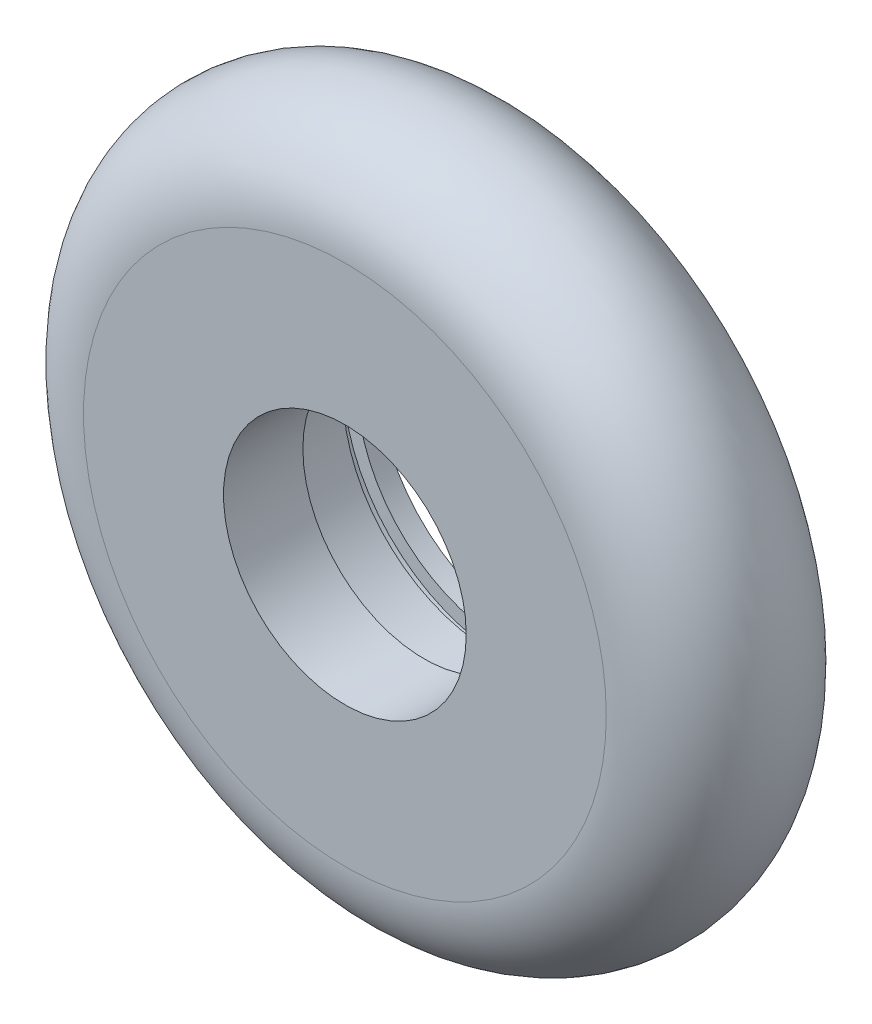
ISO-10303-21;
HEADER;
FILE_DESCRIPTION(('STEP AP214'),'2;1');
FILE_NAME('part.step','',(''),(''),'','','');
FILE_SCHEMA(('AUTOMOTIVE_DESIGN { 1 0 10303 214 1 1 1 1 }'));
ENDSEC;
DATA;
#1=APPLICATION_CONTEXT('core data for automotive mechanical design processes');
#2=APPLICATION_PROTOCOL_DEFINITION('international standard','automotive_design',2000,#1);
#3=PRODUCT_CONTEXT('',#1,'mechanical');
#4=PRODUCT('Part','Part','',(#3));
#5=PRODUCT_RELATED_PRODUCT_CATEGORY('part','',(#4));
#6=PRODUCT_DEFINITION_FORMATION('','',#4);
#7=PRODUCT_DEFINITION_CONTEXT('part definition',#1,'design');
#8=PRODUCT_DEFINITION('design','',#6,#7);
#9=PRODUCT_DEFINITION_SHAPE('','',#8);
#10=(LENGTH_UNIT() NAMED_UNIT(*) SI_UNIT(.MILLI.,.METRE.));
#11=(NAMED_UNIT(*) PLANE_ANGLE_UNIT() SI_UNIT($,.RADIAN.));
#12=(NAMED_UNIT(*) SI_UNIT($,.STERADIAN.) SOLID_ANGLE_UNIT());
#13=UNCERTAINTY_MEASURE_WITH_UNIT(LENGTH_MEASURE(1.E-05),#10,'distance_accuracy_value','');
#14=(GEOMETRIC_REPRESENTATION_CONTEXT(3) GLOBAL_UNCERTAINTY_ASSIGNED_CONTEXT((#13)) GLOBAL_UNIT_ASSIGNED_CONTEXT((#10,
#11,#12)) REPRESENTATION_CONTEXT('',''));
#15=CARTESIAN_POINT('',(0.,0.,0.));
#16=DIRECTION('',(0.,0.,1.));
#17=DIRECTION('',(1.,0.,0.));
#18=AXIS2_PLACEMENT_3D('',#15,#16,#17);
#19=CARTESIAN_POINT('',(0.,0.,-8.49999999999999));
#20=DIRECTION('',(0.,0.,-1.));
#21=DIRECTION('',(-1.,0.,0.));
#22=AXIS2_PLACEMENT_3D('',#19,#20,#21);
#23=CYLINDRICAL_SURFACE('',#22,16.);
#24=CARTESIAN_POINT('',(0.,0.,-19.5));
#25=DIRECTION('',(0.,0.,-1.));
#26=DIRECTION('',(-1.,0.,0.));
#27=AXIS2_PLACEMENT_3D('',#24,#25,#26);
#28=CIRCLE('',#27,16.);
#29=CARTESIAN_POINT('',(-16.,0.,-19.5));
#30=VERTEX_POINT('',#29);
#31=EDGE_CURVE('E49',#30,#30,#28,.T.);
#32=ORIENTED_EDGE('',*,*,#31,.T.);
#33=EDGE_LOOP('',(#32));
#34=FACE_BOUND('',#33,.T.);
#35=CARTESIAN_POINT('',(0.,0.,-17.3));
#36=DIRECTION('',(0.,0.,1.));
#37=DIRECTION('',(1.,0.,0.));
#38=AXIS2_PLACEMENT_3D('',#35,#36,#37);
#39=CIRCLE('',#38,16.);
#40=CARTESIAN_POINT('',(16.,0.,-17.3));
#41=VERTEX_POINT('',#40);
#42=EDGE_CURVE('E58',#41,#41,#39,.T.);
#43=ORIENTED_EDGE('',*,*,#42,.T.);
#44=EDGE_LOOP('',(#43));
#45=FACE_BOUND('',#44,.T.);
#46=ADVANCED_FACE('F32',(#34,#45),#23,.F.);
#47=CARTESIAN_POINT('',(0.,0.,-8.49999999999999));
#48=DIRECTION('',(0.,0.,-1.));
#49=DIRECTION('',(-1.,0.,0.));
#50=AXIS2_PLACEMENT_3D('',#47,#48,#49);
#51=CIRCLE('',#50,16.);
#52=CARTESIAN_POINT('',(-16.,0.,-8.49999999999999));
#53=VERTEX_POINT('',#52);
#54=EDGE_CURVE('E52',#53,#53,#51,.T.);
#55=ORIENTED_EDGE('',*,*,#54,.F.);
#56=EDGE_LOOP('',(#55));
#57=FACE_BOUND('',#56,.T.);
#58=CARTESIAN_POINT('',(0.,0.,-15.8));
#59=DIRECTION('',(0.,0.,1.));
#60=DIRECTION('',(1.,0.,0.));
#61=AXIS2_PLACEMENT_3D('',#58,#59,#60);
#62=CIRCLE('',#61,16.);
#63=CARTESIAN_POINT('',(16.,0.,-15.8));
#64=VERTEX_POINT('',#63);
#65=EDGE_CURVE('E61',#64,#64,#62,.T.);
#66=ORIENTED_EDGE('',*,*,#65,.F.);
#67=EDGE_LOOP('',(#66));
#68=FACE_BOUND('',#67,.T.);
#69=ADVANCED_FACE('F82',(#57,#68),#23,.F.);
#70=CARTESIAN_POINT('',(0.,0.,0.));
#71=DIRECTION('',(0.,0.,1.));
#72=DIRECTION('',(1.,0.,0.));
#73=AXIS2_PLACEMENT_3D('',#70,#71,#72);
#74=CYLINDRICAL_SURFACE('',#73,13.);
#75=CARTESIAN_POINT('',(0.,0.,0.));
#76=DIRECTION('',(0.,0.,1.));
#77=DIRECTION('',(1.,0.,0.));
#78=AXIS2_PLACEMENT_3D('',#75,#76,#77);
#79=CIRCLE('',#78,13.);
#80=CARTESIAN_POINT('',(13.,0.,0.));
#81=VERTEX_POINT('',#80);
#82=EDGE_CURVE('E10',#81,#81,#79,.T.);
#83=ORIENTED_EDGE('',*,*,#82,.T.);
#84=EDGE_LOOP('',(#83));
#85=FACE_BOUND('',#84,.T.);
#86=CARTESIAN_POINT('',(0.,0.,-8.49999999999999));
#87=DIRECTION('',(0.,0.,-1.));
#88=DIRECTION('',(-1.,0.,0.));
#89=AXIS2_PLACEMENT_3D('',#86,#87,#88);
#90=CIRCLE('',#89,13.);
#91=CARTESIAN_POINT('',(-13.,0.,-8.49999999999999));
#92=VERTEX_POINT('',#91);
#93=EDGE_CURVE('E36',#92,#92,#90,.T.);
#94=ORIENTED_EDGE('',*,*,#93,.T.);
#95=EDGE_LOOP('',(#94));
#96=FACE_BOUND('',#95,.T.);
#97=ADVANCED_FACE('F34',(#85,#96),#74,.F.);
#98=CARTESIAN_POINT('',(13.,0.,0.));
#99=DIRECTION('',(0.,0.,1.));
#100=DIRECTION('',(1.,0.,0.));
#101=AXIS2_PLACEMENT_3D('',#98,#99,#100);
#102=PLANE('',#101);
#103=CARTESIAN_POINT('',(0.,0.,0.));
#104=DIRECTION('',(0.,0.,1.));
#105=DIRECTION('',(1.,0.,0.));
#106=AXIS2_PLACEMENT_3D('',#103,#104,#105);
#107=CIRCLE('',#106,28.);
#108=CARTESIAN_POINT('',(28.,0.,0.));
#109=VERTEX_POINT('',#108);
#110=EDGE_CURVE('E40',#109,#109,#107,.T.);
#111=ORIENTED_EDGE('',*,*,#110,.T.);
#112=EDGE_LOOP('',(#111));
#113=FACE_BOUND('',#112,.T.);
#114=ORIENTED_EDGE('',*,*,#82,.F.);
#115=EDGE_LOOP('',(#114));
#116=FACE_BOUND('',#115,.T.);
#117=ADVANCED_FACE('F100',(#113,#116),#102,.T.);
#118=CARTESIAN_POINT('',(0.,0.,-9.75));
#119=DIRECTION('',(0.,0.,1.));
#120=DIRECTION('',(1.,0.,0.));
#121=AXIS2_PLACEMENT_3D('',#118,#119,#120);
#122=TOROIDAL_SURFACE('',#121,28.,9.74999999999999);
#123=CARTESIAN_POINT('',(0.,0.,-19.5));
#124=DIRECTION('',(0.,0.,1.));
#125=DIRECTION('',(1.,0.,0.));
#126=AXIS2_PLACEMENT_3D('',#123,#124,#125);
#127=CIRCLE('',#126,28.);
#128=CARTESIAN_POINT('',(28.,0.,-19.5));
#129=VERTEX_POINT('',#128);
#130=EDGE_CURVE('E44',#129,#129,#127,.T.);
#131=ORIENTED_EDGE('',*,*,#130,.T.);
#132=EDGE_LOOP('',(#131));
#133=FACE_BOUND('',#132,.T.);
#134=ORIENTED_EDGE('',*,*,#110,.F.);
#135=EDGE_LOOP('',(#134));
#136=FACE_BOUND('',#135,.T.);
#137=ADVANCED_FACE('F97',(#133,#136),#122,.T.);
#138=CARTESIAN_POINT('',(28.,0.,-19.5));
#139=DIRECTION('',(0.,0.,-1.));
#140=DIRECTION('',(-1.,0.,0.));
#141=AXIS2_PLACEMENT_3D('',#138,#139,#140);
#142=PLANE('',#141);
#143=ORIENTED_EDGE('',*,*,#31,.F.);
#144=EDGE_LOOP('',(#143));
#145=FACE_BOUND('',#144,.T.);
#146=ORIENTED_EDGE('',*,*,#130,.F.);
#147=EDGE_LOOP('',(#146));
#148=FACE_BOUND('',#147,.T.);
#149=ADVANCED_FACE('F94',(#145,#148),#142,.T.);
#150=CARTESIAN_POINT('',(0.,0.,-8.49999999999999));
#151=DIRECTION('',(0.,0.,-1.));
#152=DIRECTION('',(-1.,0.,0.));
#153=AXIS2_PLACEMENT_3D('',#150,#151,#152);
#154=PLANE('',#153);
#155=ORIENTED_EDGE('',*,*,#93,.F.);
#156=EDGE_LOOP('',(#155));
#157=FACE_BOUND('',#156,.T.);
#158=ORIENTED_EDGE('',*,*,#54,.T.);
#159=EDGE_LOOP('',(#158));
#160=FACE_BOUND('',#159,.T.);
#161=ADVANCED_FACE('F92',(#157,#160),#154,.T.);
#162=CARTESIAN_POINT('',(0.,0.,0.));
#163=DIRECTION('',(0.,0.,1.));
#164=DIRECTION('',(1.,0.,0.));
#165=AXIS2_PLACEMENT_3D('',#162,#163,#164);
#166=CYLINDRICAL_SURFACE('',#165,17.5);
#167=CARTESIAN_POINT('',(0.,0.,-15.8));
#168=DIRECTION('',(0.,0.,1.));
#169=DIRECTION('',(1.,0.,0.));
#170=AXIS2_PLACEMENT_3D('',#167,#168,#169);
#171=CIRCLE('',#170,17.5);
#172=CARTESIAN_POINT('',(17.5,0.,-15.8));
#173=VERTEX_POINT('',#172);
#174=EDGE_CURVE('E64',#173,#173,#171,.T.);
#175=ORIENTED_EDGE('',*,*,#174,.T.);
#176=EDGE_LOOP('',(#175));
#177=FACE_BOUND('',#176,.T.);
#178=CARTESIAN_POINT('',(0.,0.,-17.3));
#179=DIRECTION('',(0.,0.,1.));
#180=DIRECTION('',(1.,0.,0.));
#181=AXIS2_PLACEMENT_3D('',#178,#179,#180);
#182=CIRCLE('',#181,17.5);
#183=CARTESIAN_POINT('',(17.5,0.,-17.3));
#184=VERTEX_POINT('',#183);
#185=EDGE_CURVE('E53',#184,#184,#182,.T.);
#186=ORIENTED_EDGE('',*,*,#185,.F.);
#187=EDGE_LOOP('',(#186));
#188=FACE_BOUND('',#187,.T.);
#189=ADVANCED_FACE('F68',(#177,#188),#166,.F.);
#190=CARTESIAN_POINT('',(0.,0.,-17.3));
#191=DIRECTION('',(0.,0.,1.));
#192=DIRECTION('',(1.,0.,0.));
#193=AXIS2_PLACEMENT_3D('',#190,#191,#192);
#194=PLANE('',#193);
#195=ORIENTED_EDGE('',*,*,#185,.T.);
#196=EDGE_LOOP('',(#195));
#197=FACE_BOUND('',#196,.T.);
#198=ORIENTED_EDGE('',*,*,#42,.F.);
#199=EDGE_LOOP('',(#198));
#200=FACE_BOUND('',#199,.T.);
#201=ADVANCED_FACE('F73',(#197,#200),#194,.T.);
#202=CARTESIAN_POINT('',(0.,0.,-15.8));
#203=DIRECTION('',(0.,0.,-1.));
#204=DIRECTION('',(-1.,0.,0.));
#205=AXIS2_PLACEMENT_3D('',#202,#203,#204);
#206=PLANE('',#205);
#207=ORIENTED_EDGE('',*,*,#65,.T.);
#208=EDGE_LOOP('',(#207));
#209=FACE_BOUND('',#208,.T.);
#210=ORIENTED_EDGE('',*,*,#174,.F.);
#211=EDGE_LOOP('',(#210));
#212=FACE_BOUND('',#211,.T.);
#213=ADVANCED_FACE('F71',(#209,#212),#206,.T.);
#214=CLOSED_SHELL('',(#46,#69,#97,#117,#137,#149,#161,#189,#201,#213));
#215=MANIFOLD_SOLID_BREP('B2',#214);
#216=ADVANCED_BREP_SHAPE_REPRESENTATION('',(#18,#215),#14);
#217=SHAPE_DEFINITION_REPRESENTATION(#9,#216);
ENDSEC;
END-ISO-10303-21;
